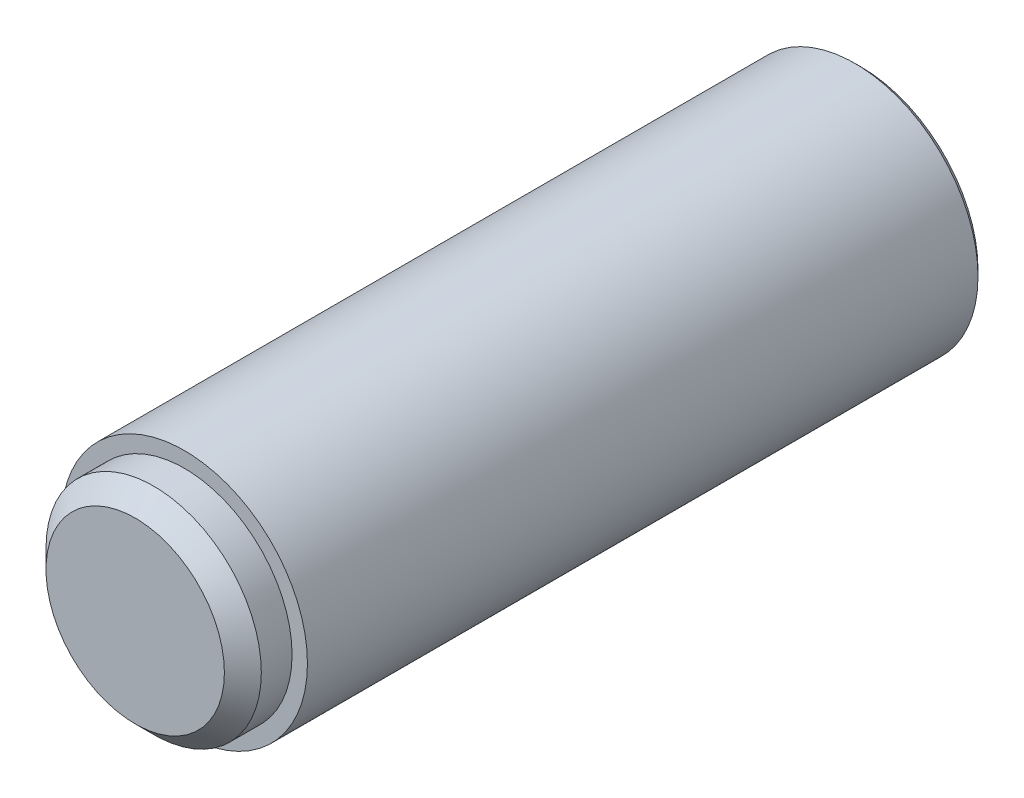
ISO-10303-21;
HEADER;
FILE_DESCRIPTION(('STEP AP214'),'2;1');
FILE_NAME('part.step','',(''),(''),'','','');
FILE_SCHEMA(('AUTOMOTIVE_DESIGN { 1 0 10303 214 1 1 1 1 }'));
ENDSEC;
DATA;
#1=APPLICATION_CONTEXT('core data for automotive mechanical design processes');
#2=APPLICATION_PROTOCOL_DEFINITION('international standard','automotive_design',2000,#1);
#3=PRODUCT_CONTEXT('',#1,'mechanical');
#4=PRODUCT('Part','Part','',(#3));
#5=PRODUCT_RELATED_PRODUCT_CATEGORY('part','',(#4));
#6=PRODUCT_DEFINITION_FORMATION('','',#4);
#7=PRODUCT_DEFINITION_CONTEXT('part definition',#1,'design');
#8=PRODUCT_DEFINITION('design','',#6,#7);
#9=PRODUCT_DEFINITION_SHAPE('','',#8);
#10=(LENGTH_UNIT() NAMED_UNIT(*) SI_UNIT(.MILLI.,.METRE.));
#11=(NAMED_UNIT(*) PLANE_ANGLE_UNIT() SI_UNIT($,.RADIAN.));
#12=(NAMED_UNIT(*) SI_UNIT($,.STERADIAN.) SOLID_ANGLE_UNIT());
#13=UNCERTAINTY_MEASURE_WITH_UNIT(LENGTH_MEASURE(1.E-05),#10,'distance_accuracy_value','');
#14=(GEOMETRIC_REPRESENTATION_CONTEXT(3) GLOBAL_UNCERTAINTY_ASSIGNED_CONTEXT((#13)) GLOBAL_UNIT_ASSIGNED_CONTEXT((#10,
#11,#12)) REPRESENTATION_CONTEXT('',''));
#15=CARTESIAN_POINT('',(0.,0.,0.));
#16=DIRECTION('',(0.,0.,1.));
#17=DIRECTION('',(1.,0.,0.));
#18=AXIS2_PLACEMENT_3D('',#15,#16,#17);
#19=CARTESIAN_POINT('',(0.,0.,110.));
#20=DIRECTION('',(0.,0.,-1.));
#21=DIRECTION('',(-1.,0.,0.));
#22=AXIS2_PLACEMENT_3D('',#19,#20,#21);
#23=CYLINDRICAL_SURFACE('',#22,20.);
#24=CARTESIAN_POINT('',(0.,0.,0.999999999999987));
#25=DIRECTION('',(0.,0.,1.));
#26=DIRECTION('',(1.,0.,0.));
#27=AXIS2_PLACEMENT_3D('',#24,#25,#26);
#28=CIRCLE('',#27,20.);
#29=CARTESIAN_POINT('',(20.,0.,0.999999999999987));
#30=VERTEX_POINT('',#29);
#31=EDGE_CURVE('E39',#30,#30,#28,.T.);
#32=ORIENTED_EDGE('',*,*,#31,.T.);
#33=EDGE_LOOP('',(#32));
#34=FACE_BOUND('',#33,.T.);
#35=CARTESIAN_POINT('',(0.,0.,110.));
#36=DIRECTION('',(0.,0.,1.));
#37=DIRECTION('',(1.,0.,0.));
#38=AXIS2_PLACEMENT_3D('',#35,#36,#37);
#39=CIRCLE('',#38,20.);
#40=CARTESIAN_POINT('',(20.,0.,110.));
#41=VERTEX_POINT('',#40);
#42=EDGE_CURVE('E53',#41,#41,#39,.T.);
#43=ORIENTED_EDGE('',*,*,#42,.F.);
#44=EDGE_LOOP('',(#43));
#45=FACE_BOUND('',#44,.T.);
#46=ADVANCED_FACE('F32',(#34,#45),#23,.T.);
#47=CARTESIAN_POINT('',(0.,0.,110.));
#48=DIRECTION('',(0.,0.,1.));
#49=DIRECTION('',(1.,0.,0.));
#50=AXIS2_PLACEMENT_3D('',#47,#48,#49);
#51=PLANE('',#50);
#52=CARTESIAN_POINT('',(0.,0.,110.));
#53=DIRECTION('',(0.,0.,1.));
#54=DIRECTION('',(1.,0.,0.));
#55=AXIS2_PLACEMENT_3D('',#52,#53,#54);
#56=CIRCLE('',#55,17.5);
#57=CARTESIAN_POINT('',(17.5,0.,110.));
#58=VERTEX_POINT('',#57);
#59=EDGE_CURVE('E52',#58,#58,#56,.T.);
#60=ORIENTED_EDGE('',*,*,#59,.F.);
#61=EDGE_LOOP('',(#60));
#62=FACE_BOUND('',#61,.T.);
#63=ORIENTED_EDGE('',*,*,#42,.T.);
#64=EDGE_LOOP('',(#63));
#65=FACE_BOUND('',#64,.T.);
#66=ADVANCED_FACE('F61',(#62,#65),#51,.T.);
#67=CARTESIAN_POINT('',(0.,0.,0.));
#68=DIRECTION('',(0.,0.,1.));
#69=DIRECTION('',(1.,0.,0.));
#70=AXIS2_PLACEMENT_3D('',#67,#68,#69);
#71=PLANE('',#70);
#72=CARTESIAN_POINT('',(0.,0.,0.));
#73=DIRECTION('',(0.,0.,1.));
#74=DIRECTION('',(1.,0.,0.));
#75=AXIS2_PLACEMENT_3D('',#72,#73,#74);
#76=CIRCLE('',#75,19.);
#77=CARTESIAN_POINT('',(19.,0.,0.));
#78=VERTEX_POINT('',#77);
#79=EDGE_CURVE('E10',#78,#78,#76,.F.);
#80=ORIENTED_EDGE('',*,*,#79,.T.);
#81=EDGE_LOOP('',(#80));
#82=FACE_BOUND('',#81,.T.);
#83=ADVANCED_FACE('F64',(#82),#71,.F.);
#84=CARTESIAN_POINT('',(0.,0.,118.));
#85=DIRECTION('',(0.,0.,-1.));
#86=DIRECTION('',(-1.,0.,0.));
#87=AXIS2_PLACEMENT_3D('',#84,#85,#86);
#88=CYLINDRICAL_SURFACE('',#87,17.5);
#89=CARTESIAN_POINT('',(0.,0.,115.));
#90=DIRECTION('',(0.,0.,1.));
#91=DIRECTION('',(1.,0.,0.));
#92=AXIS2_PLACEMENT_3D('',#89,#90,#91);
#93=CIRCLE('',#92,17.5);
#94=CARTESIAN_POINT('',(17.5,0.,115.));
#95=VERTEX_POINT('',#94);
#96=EDGE_CURVE('E43',#95,#95,#93,.F.);
#97=ORIENTED_EDGE('',*,*,#96,.T.);
#98=EDGE_LOOP('',(#97));
#99=FACE_BOUND('',#98,.T.);
#100=ORIENTED_EDGE('',*,*,#59,.T.);
#101=EDGE_LOOP('',(#100));
#102=FACE_BOUND('',#101,.T.);
#103=ADVANCED_FACE('F59',(#99,#102),#88,.T.);
#104=CARTESIAN_POINT('',(0.,0.,118.));
#105=DIRECTION('',(0.,0.,1.));
#106=DIRECTION('',(1.,0.,0.));
#107=AXIS2_PLACEMENT_3D('',#104,#105,#106);
#108=PLANE('',#107);
#109=CARTESIAN_POINT('',(0.,0.,118.));
#110=DIRECTION('',(0.,0.,1.));
#111=DIRECTION('',(1.,0.,0.));
#112=AXIS2_PLACEMENT_3D('',#109,#110,#111);
#113=CIRCLE('',#112,14.5);
#114=CARTESIAN_POINT('',(14.5,0.,118.));
#115=VERTEX_POINT('',#114);
#116=EDGE_CURVE('E47',#115,#115,#113,.T.);
#117=ORIENTED_EDGE('',*,*,#116,.T.);
#118=EDGE_LOOP('',(#117));
#119=FACE_BOUND('',#118,.T.);
#120=ADVANCED_FACE('F75',(#119),#108,.T.);
#121=CARTESIAN_POINT('',(0.,0.,118.));
#122=DIRECTION('',(0.,0.,-1.));
#123=DIRECTION('',(-1.,0.,0.));
#124=AXIS2_PLACEMENT_3D('',#121,#122,#123);
#125=CONICAL_SURFACE('',#124,14.5,0.785398163397447);
#126=ORIENTED_EDGE('',*,*,#96,.F.);
#127=EDGE_LOOP('',(#126));
#128=FACE_BOUND('',#127,.T.);
#129=ORIENTED_EDGE('',*,*,#116,.F.);
#130=EDGE_LOOP('',(#129));
#131=FACE_BOUND('',#130,.T.);
#132=ADVANCED_FACE('F73',(#128,#131),#125,.T.);
#133=CARTESIAN_POINT('',(0.,0.,0.999999999999987));
#134=DIRECTION('',(0.,0.,1.));
#135=DIRECTION('',(1.,0.,0.));
#136=AXIS2_PLACEMENT_3D('',#133,#134,#135);
#137=CONICAL_SURFACE('',#136,20.,0.785398163397445);
#138=ORIENTED_EDGE('',*,*,#79,.F.);
#139=EDGE_LOOP('',(#138));
#140=FACE_BOUND('',#139,.T.);
#141=ORIENTED_EDGE('',*,*,#31,.F.);
#142=EDGE_LOOP('',(#141));
#143=FACE_BOUND('',#142,.T.);
#144=ADVANCED_FACE('F34',(#140,#143),#137,.T.);
#145=CLOSED_SHELL('',(#46,#66,#83,#103,#120,#132,#144));
#146=MANIFOLD_SOLID_BREP('B2',#145);
#147=ADVANCED_BREP_SHAPE_REPRESENTATION('',(#18,#146),#14);
#148=SHAPE_DEFINITION_REPRESENTATION(#9,#147);
ENDSEC;
END-ISO-10303-21;
